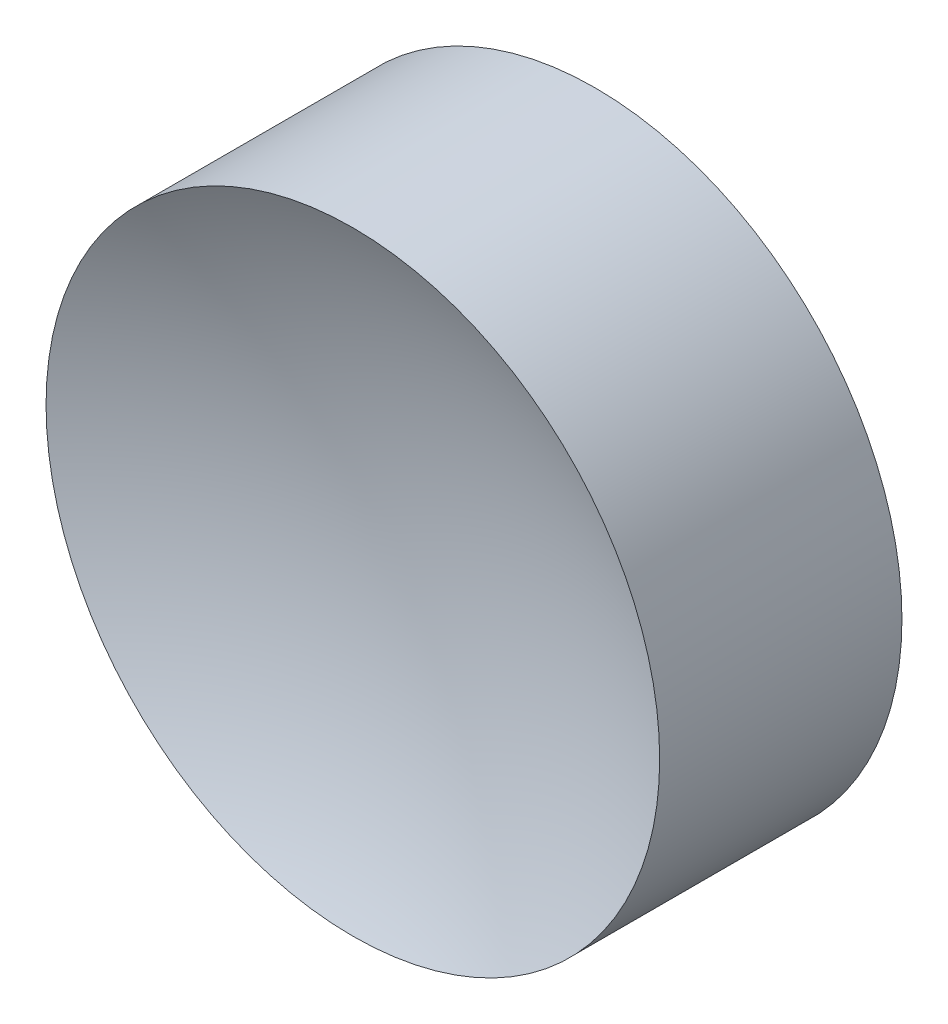
ISO-10303-21;
HEADER;
FILE_DESCRIPTION(('STEP AP214'),'2;1');
FILE_NAME('part.step','',(''),(''),'','','');
FILE_SCHEMA(('AUTOMOTIVE_DESIGN { 1 0 10303 214 1 1 1 1 }'));
ENDSEC;
DATA;
#1=APPLICATION_CONTEXT('core data for automotive mechanical design processes');
#2=APPLICATION_PROTOCOL_DEFINITION('international standard','automotive_design',2000,#1);
#3=PRODUCT_CONTEXT('',#1,'mechanical');
#4=PRODUCT('Part','Part','',(#3));
#5=PRODUCT_RELATED_PRODUCT_CATEGORY('part','',(#4));
#6=PRODUCT_DEFINITION_FORMATION('','',#4);
#7=PRODUCT_DEFINITION_CONTEXT('part definition',#1,'design');
#8=PRODUCT_DEFINITION('design','',#6,#7);
#9=PRODUCT_DEFINITION_SHAPE('','',#8);
#10=(LENGTH_UNIT() NAMED_UNIT(*) SI_UNIT(.MILLI.,.METRE.));
#11=(NAMED_UNIT(*) PLANE_ANGLE_UNIT() SI_UNIT($,.RADIAN.));
#12=(NAMED_UNIT(*) SI_UNIT($,.STERADIAN.) SOLID_ANGLE_UNIT());
#13=UNCERTAINTY_MEASURE_WITH_UNIT(LENGTH_MEASURE(1.E-05),#10,'distance_accuracy_value','');
#14=(GEOMETRIC_REPRESENTATION_CONTEXT(3) GLOBAL_UNCERTAINTY_ASSIGNED_CONTEXT((#13)) GLOBAL_UNIT_ASSIGNED_CONTEXT((#10,
#11,#12)) REPRESENTATION_CONTEXT('',''));
#15=CARTESIAN_POINT('',(0.,0.,0.));
#16=DIRECTION('',(0.,0.,1.));
#17=DIRECTION('',(1.,0.,0.));
#18=AXIS2_PLACEMENT_3D('',#15,#16,#17);
#19=CARTESIAN_POINT('',(0.,0.,26.79));
#20=DIRECTION('',(0.,0.,1.));
#21=DIRECTION('',(-1.,0.,0.));
#22=AXIS2_PLACEMENT_3D('',#19,#20,#21);
#23=SPHERICAL_SURFACE('',#22,26.79);
#24=CARTESIAN_POINT('',(0.,0.,2.83787900832162));
#25=DIRECTION('',(0.,0.,1.));
#26=DIRECTION('',(1.,0.,0.));
#27=AXIS2_PLACEMENT_3D('',#24,#25,#26);
#28=CIRCLE('',#27,12.);
#29=CARTESIAN_POINT('',(12.,0.,2.83787900832162));
#30=VERTEX_POINT('',#29);
#31=EDGE_CURVE('E43',#30,#30,#28,.T.);
#32=ORIENTED_EDGE('',*,*,#31,.T.);
#33=EDGE_LOOP('',(#32));
#34=FACE_BOUND('',#33,.T.);
#35=ADVANCED_FACE('F37',(#34),#23,.F.);
#36=CARTESIAN_POINT('',(0.,0.,-30.59));
#37=DIRECTION('',(0.,0.,1.));
#38=DIRECTION('',(1.,0.,0.));
#39=AXIS2_PLACEMENT_3D('',#36,#37,#38);
#40=SPHERICAL_SURFACE('',#39,26.79);
#41=CARTESIAN_POINT('',(0.,0.,-6.63787900832161));
#42=DIRECTION('',(0.,0.,1.));
#43=DIRECTION('',(1.,0.,0.));
#44=AXIS2_PLACEMENT_3D('',#41,#42,#43);
#45=CIRCLE('',#44,12.);
#46=CARTESIAN_POINT('',(12.,0.,-6.63787900832161));
#47=VERTEX_POINT('',#46);
#48=EDGE_CURVE('E10',#47,#47,#45,.T.);
#49=ORIENTED_EDGE('',*,*,#48,.F.);
#50=EDGE_LOOP('',(#49));
#51=FACE_BOUND('',#50,.T.);
#52=ADVANCED_FACE('F52',(#51),#40,.F.);
#53=CARTESIAN_POINT('',(0.,0.,0.));
#54=DIRECTION('',(0.,0.,1.));
#55=DIRECTION('',(1.,0.,0.));
#56=AXIS2_PLACEMENT_3D('',#53,#54,#55);
#57=CYLINDRICAL_SURFACE('',#56,12.);
#58=ORIENTED_EDGE('',*,*,#31,.F.);
#59=EDGE_LOOP('',(#58));
#60=FACE_BOUND('',#59,.T.);
#61=ORIENTED_EDGE('',*,*,#48,.T.);
#62=EDGE_LOOP('',(#61));
#63=FACE_BOUND('',#62,.T.);
#64=ADVANCED_FACE('F50',(#60,#63),#57,.T.);
#65=CLOSED_SHELL('',(#35,#52,#64));
#66=MANIFOLD_SOLID_BREP('B2',#65);
#67=ADVANCED_BREP_SHAPE_REPRESENTATION('',(#18,#66),#14);
#68=SHAPE_DEFINITION_REPRESENTATION(#9,#67);
ENDSEC;
END-ISO-10303-21;
